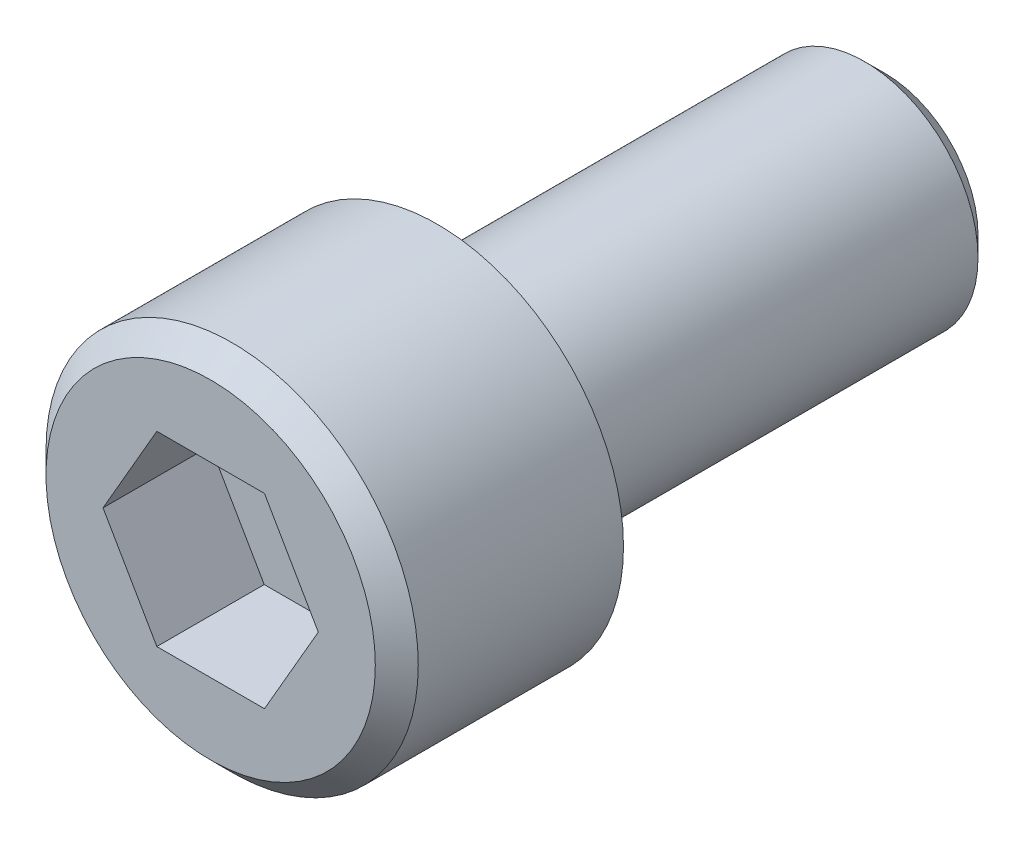
ISO-10303-21;
HEADER;
FILE_DESCRIPTION(('STEP AP214'),'2;1');
FILE_NAME('part.step','',(''),(''),'','','');
FILE_SCHEMA(('AUTOMOTIVE_DESIGN { 1 0 10303 214 1 1 1 1 }'));
ENDSEC;
DATA;
#1=APPLICATION_CONTEXT('core data for automotive mechanical design processes');
#2=APPLICATION_PROTOCOL_DEFINITION('international standard','automotive_design',2000,#1);
#3=PRODUCT_CONTEXT('',#1,'mechanical');
#4=PRODUCT('Part','Part','',(#3));
#5=PRODUCT_RELATED_PRODUCT_CATEGORY('part','',(#4));
#6=PRODUCT_DEFINITION_FORMATION('','',#4);
#7=PRODUCT_DEFINITION_CONTEXT('part definition',#1,'design');
#8=PRODUCT_DEFINITION('design','',#6,#7);
#9=PRODUCT_DEFINITION_SHAPE('','',#8);
#10=(LENGTH_UNIT() NAMED_UNIT(*) SI_UNIT(.MILLI.,.METRE.));
#11=(NAMED_UNIT(*) PLANE_ANGLE_UNIT() SI_UNIT($,.RADIAN.));
#12=(NAMED_UNIT(*) SI_UNIT($,.STERADIAN.) SOLID_ANGLE_UNIT());
#13=UNCERTAINTY_MEASURE_WITH_UNIT(LENGTH_MEASURE(1.E-05),#10,'distance_accuracy_value','');
#14=(GEOMETRIC_REPRESENTATION_CONTEXT(3) GLOBAL_UNCERTAINTY_ASSIGNED_CONTEXT((#13)) GLOBAL_UNIT_ASSIGNED_CONTEXT((#10,
#11,#12)) REPRESENTATION_CONTEXT('',''));
#15=CARTESIAN_POINT('',(0.,0.,0.));
#16=DIRECTION('',(0.,0.,1.));
#17=DIRECTION('',(1.,0.,0.));
#18=AXIS2_PLACEMENT_3D('',#15,#16,#17);
#19=CARTESIAN_POINT('',(0.,0.,4.826));
#20=DIRECTION('',(0.,0.,-1.));
#21=DIRECTION('',(-1.,0.,0.));
#22=AXIS2_PLACEMENT_3D('',#19,#20,#21);
#23=CYLINDRICAL_SURFACE('',#22,3.9624);
#24=CARTESIAN_POINT('',(0.,0.,4.3688));
#25=DIRECTION('',(0.,0.,1.));
#26=DIRECTION('',(1.,0.,0.));
#27=AXIS2_PLACEMENT_3D('',#24,#25,#26);
#28=CIRCLE('',#27,3.9624);
#29=CARTESIAN_POINT('',(3.9624,0.,4.3688));
#30=VERTEX_POINT('',#29);
#31=EDGE_CURVE('E148',#30,#30,#28,.F.);
#32=ORIENTED_EDGE('',*,*,#31,.T.);
#33=EDGE_LOOP('',(#32));
#34=FACE_BOUND('',#33,.T.);
#35=CARTESIAN_POINT('',(0.,0.,0.));
#36=DIRECTION('',(0.,0.,1.));
#37=DIRECTION('',(1.,0.,0.));
#38=AXIS2_PLACEMENT_3D('',#35,#36,#37);
#39=CIRCLE('',#38,3.9624);
#40=CARTESIAN_POINT('',(3.9624,0.,0.));
#41=VERTEX_POINT('',#40);
#42=EDGE_CURVE('E140',#41,#41,#39,.T.);
#43=ORIENTED_EDGE('',*,*,#42,.T.);
#44=EDGE_LOOP('',(#43));
#45=FACE_BOUND('',#44,.T.);
#46=ADVANCED_FACE('F17',(#34,#45),#23,.T.);
#47=CARTESIAN_POINT('',(0.,0.,4.826));
#48=DIRECTION('',(0.,0.,1.));
#49=DIRECTION('',(1.,0.,0.));
#50=AXIS2_PLACEMENT_3D('',#47,#48,#49);
#51=PLANE('',#50);
#52=CARTESIAN_POINT('',(0.,0.,4.826));
#53=DIRECTION('',(0.,0.,1.));
#54=DIRECTION('',(1.,0.,0.));
#55=AXIS2_PLACEMENT_3D('',#52,#53,#54);
#56=CIRCLE('',#55,3.5052);
#57=CARTESIAN_POINT('',(3.5052,0.,4.826));
#58=VERTEX_POINT('',#57);
#59=EDGE_CURVE('E144',#58,#58,#56,.T.);
#60=ORIENTED_EDGE('',*,*,#59,.T.);
#61=EDGE_LOOP('',(#60));
#62=FACE_BOUND('',#61,.T.);
#63=DIRECTION('',(-0.5,0.866025403784439,0.));
#64=VECTOR('',#63,1.);
#65=CARTESIAN_POINT('',(1.71851916063474,0.9921875,4.826));
#66=LINE('',#65,#64);
#67=CARTESIAN_POINT('',(2.29135888084633,0.,4.826));
#68=VERTEX_POINT('',#67);
#69=CARTESIAN_POINT('',(1.14567944042316,1.984375,4.826));
#70=VERTEX_POINT('',#69);
#71=EDGE_CURVE('E111',#68,#70,#66,.T.);
#72=ORIENTED_EDGE('',*,*,#71,.F.);
#73=DIRECTION('',(0.5,0.866025403784439,0.));
#74=VECTOR('',#73,1.);
#75=CARTESIAN_POINT('',(1.71851916063474,-0.9921875,4.826));
#76=LINE('',#75,#74);
#77=CARTESIAN_POINT('',(1.14567944042316,-1.984375,4.826));
#78=VERTEX_POINT('',#77);
#79=EDGE_CURVE('E125',#78,#68,#76,.T.);
#80=ORIENTED_EDGE('',*,*,#79,.F.);
#81=DIRECTION('',(1.,0.,0.));
#82=VECTOR('',#81,1.);
#83=CARTESIAN_POINT('',(0.,-1.984375,4.826));
#84=LINE('',#83,#82);
#85=CARTESIAN_POINT('',(-1.14567944042316,-1.984375,4.826));
#86=VERTEX_POINT('',#85);
#87=EDGE_CURVE('E34',#86,#78,#84,.T.);
#88=ORIENTED_EDGE('',*,*,#87,.F.);
#89=DIRECTION('',(0.5,-0.866025403784439,0.));
#90=VECTOR('',#89,1.);
#91=CARTESIAN_POINT('',(-1.71851916063474,-0.9921875,4.826));
#92=LINE('',#91,#90);
#93=CARTESIAN_POINT('',(-2.29135888084633,0.,4.826));
#94=VERTEX_POINT('',#93);
#95=EDGE_CURVE('E83',#94,#86,#92,.T.);
#96=ORIENTED_EDGE('',*,*,#95,.F.);
#97=DIRECTION('',(-0.5,-0.866025403784439,0.));
#98=VECTOR('',#97,1.);
#99=CARTESIAN_POINT('',(-1.71851916063474,0.9921875,4.826));
#100=LINE('',#99,#98);
#101=CARTESIAN_POINT('',(-1.14567944042316,1.984375,4.826));
#102=VERTEX_POINT('',#101);
#103=EDGE_CURVE('E117',#102,#94,#100,.T.);
#104=ORIENTED_EDGE('',*,*,#103,.F.);
#105=DIRECTION('',(-1.,0.,0.));
#106=VECTOR('',#105,1.);
#107=CARTESIAN_POINT('',(0.,1.984375,4.826));
#108=LINE('',#107,#106);
#109=EDGE_CURVE('E113',#70,#102,#108,.T.);
#110=ORIENTED_EDGE('',*,*,#109,.F.);
#111=EDGE_LOOP('',(#72,#80,#88,#96,#104,#110));
#112=FACE_BOUND('',#111,.T.);
#113=ADVANCED_FACE('F175',(#62,#112),#51,.T.);
#114=CARTESIAN_POINT('',(0.,0.,0.));
#115=DIRECTION('',(0.,0.,1.));
#116=DIRECTION('',(1.,0.,0.));
#117=AXIS2_PLACEMENT_3D('',#114,#115,#116);
#118=PLANE('',#117);
#119=CARTESIAN_POINT('',(0.,0.,0.));
#120=DIRECTION('',(0.,0.,-1.));
#121=DIRECTION('',(-1.,0.,0.));
#122=AXIS2_PLACEMENT_3D('',#119,#120,#121);
#123=CIRCLE('',#122,2.413);
#124=CARTESIAN_POINT('',(-2.413,0.,0.));
#125=VERTEX_POINT('',#124);
#126=EDGE_CURVE('E151',#125,#125,#123,.T.);
#127=ORIENTED_EDGE('',*,*,#126,.F.);
#128=EDGE_LOOP('',(#127));
#129=FACE_BOUND('',#128,.T.);
#130=ORIENTED_EDGE('',*,*,#42,.F.);
#131=EDGE_LOOP('',(#130));
#132=FACE_BOUND('',#131,.T.);
#133=ADVANCED_FACE('F181',(#129,#132),#118,.F.);
#134=CARTESIAN_POINT('',(1.71851916063474,0.9921875,2.54));
#135=DIRECTION('',(0.866025403784439,0.5,0.));
#136=DIRECTION('',(-0.5,0.866025403784439,0.));
#137=AXIS2_PLACEMENT_3D('',#134,#135,#136);
#138=PLANE('',#137);
#139=ORIENTED_EDGE('',*,*,#71,.T.);
#140=DIRECTION('',(0.,0.,1.));
#141=VECTOR('',#140,1.);
#142=CARTESIAN_POINT('',(1.14567944042316,1.984375,2.54));
#143=LINE('',#142,#141);
#144=CARTESIAN_POINT('',(1.14567944042316,1.984375,2.54));
#145=VERTEX_POINT('',#144);
#146=EDGE_CURVE('E67',#145,#70,#143,.T.);
#147=ORIENTED_EDGE('',*,*,#146,.F.);
#148=DIRECTION('',(-0.5,0.866025403784439,0.));
#149=VECTOR('',#148,1.);
#150=CARTESIAN_POINT('',(1.71851916063474,0.9921875,2.54));
#151=LINE('',#150,#149);
#152=CARTESIAN_POINT('',(2.29135888084633,0.,2.54));
#153=VERTEX_POINT('',#152);
#154=EDGE_CURVE('E128',#153,#145,#151,.T.);
#155=ORIENTED_EDGE('',*,*,#154,.F.);
#156=DIRECTION('',(0.,0.,1.));
#157=VECTOR('',#156,1.);
#158=CARTESIAN_POINT('',(2.29135888084633,0.,2.54));
#159=LINE('',#158,#157);
#160=EDGE_CURVE('E43',#153,#68,#159,.T.);
#161=ORIENTED_EDGE('',*,*,#160,.T.);
#162=EDGE_LOOP('',(#139,#147,#155,#161));
#163=FACE_BOUND('',#162,.T.);
#164=ADVANCED_FACE('F178',(#163),#138,.F.);
#165=CARTESIAN_POINT('',(0.,1.984375,2.54));
#166=DIRECTION('',(0.,1.,0.));
#167=DIRECTION('',(0.,0.,1.));
#168=AXIS2_PLACEMENT_3D('',#165,#166,#167);
#169=PLANE('',#168);
#170=ORIENTED_EDGE('',*,*,#109,.T.);
#171=DIRECTION('',(0.,0.,1.));
#172=VECTOR('',#171,1.);
#173=CARTESIAN_POINT('',(-1.14567944042316,1.984375,2.54));
#174=LINE('',#173,#172);
#175=CARTESIAN_POINT('',(-1.14567944042316,1.984375,2.54));
#176=VERTEX_POINT('',#175);
#177=EDGE_CURVE('E135',#176,#102,#174,.T.);
#178=ORIENTED_EDGE('',*,*,#177,.F.);
#179=DIRECTION('',(-1.,0.,0.));
#180=VECTOR('',#179,1.);
#181=CARTESIAN_POINT('',(0.,1.984375,2.54));
#182=LINE('',#181,#180);
#183=EDGE_CURVE('E164',#145,#176,#182,.T.);
#184=ORIENTED_EDGE('',*,*,#183,.F.);
#185=ORIENTED_EDGE('',*,*,#146,.T.);
#186=EDGE_LOOP('',(#170,#178,#184,#185));
#187=FACE_BOUND('',#186,.T.);
#188=ADVANCED_FACE('F180',(#187),#169,.F.);
#189=CARTESIAN_POINT('',(-1.71851916063474,0.9921875,2.54));
#190=DIRECTION('',(-0.866025403784439,0.5,0.));
#191=DIRECTION('',(-0.5,-0.866025403784439,0.));
#192=AXIS2_PLACEMENT_3D('',#189,#190,#191);
#193=PLANE('',#192);
#194=ORIENTED_EDGE('',*,*,#103,.T.);
#195=DIRECTION('',(0.,0.,1.));
#196=VECTOR('',#195,1.);
#197=CARTESIAN_POINT('',(-2.29135888084633,0.,2.54));
#198=LINE('',#197,#196);
#199=CARTESIAN_POINT('',(-2.29135888084633,0.,2.54));
#200=VERTEX_POINT('',#199);
#201=EDGE_CURVE('E86',#200,#94,#198,.T.);
#202=ORIENTED_EDGE('',*,*,#201,.F.);
#203=DIRECTION('',(-0.5,-0.866025403784439,0.));
#204=VECTOR('',#203,1.);
#205=CARTESIAN_POINT('',(-1.71851916063474,0.9921875,2.54));
#206=LINE('',#205,#204);
#207=EDGE_CURVE('E97',#176,#200,#206,.T.);
#208=ORIENTED_EDGE('',*,*,#207,.F.);
#209=ORIENTED_EDGE('',*,*,#177,.T.);
#210=EDGE_LOOP('',(#194,#202,#208,#209));
#211=FACE_BOUND('',#210,.T.);
#212=ADVANCED_FACE('F170',(#211),#193,.F.);
#213=CARTESIAN_POINT('',(-1.71851916063474,-0.9921875,2.54));
#214=DIRECTION('',(-0.866025403784439,-0.5,0.));
#215=DIRECTION('',(0.5,-0.866025403784439,0.));
#216=AXIS2_PLACEMENT_3D('',#213,#214,#215);
#217=PLANE('',#216);
#218=ORIENTED_EDGE('',*,*,#95,.T.);
#219=DIRECTION('',(0.,0.,1.));
#220=VECTOR('',#219,1.);
#221=CARTESIAN_POINT('',(-1.14567944042316,-1.984375,2.54));
#222=LINE('',#221,#220);
#223=CARTESIAN_POINT('',(-1.14567944042316,-1.984375,2.54));
#224=VERTEX_POINT('',#223);
#225=EDGE_CURVE('E78',#224,#86,#222,.T.);
#226=ORIENTED_EDGE('',*,*,#225,.F.);
#227=DIRECTION('',(0.5,-0.866025403784439,0.));
#228=VECTOR('',#227,1.);
#229=CARTESIAN_POINT('',(-1.71851916063474,-0.9921875,2.54));
#230=LINE('',#229,#228);
#231=EDGE_CURVE('E81',#200,#224,#230,.T.);
#232=ORIENTED_EDGE('',*,*,#231,.F.);
#233=ORIENTED_EDGE('',*,*,#201,.T.);
#234=EDGE_LOOP('',(#218,#226,#232,#233));
#235=FACE_BOUND('',#234,.T.);
#236=ADVANCED_FACE('F80',(#235),#217,.F.);
#237=CARTESIAN_POINT('',(0.,-1.984375,2.54));
#238=DIRECTION('',(0.,-1.,0.));
#239=DIRECTION('',(0.,0.,-1.));
#240=AXIS2_PLACEMENT_3D('',#237,#238,#239);
#241=PLANE('',#240);
#242=ORIENTED_EDGE('',*,*,#87,.T.);
#243=DIRECTION('',(0.,0.,1.));
#244=VECTOR('',#243,1.);
#245=CARTESIAN_POINT('',(1.14567944042316,-1.984375,2.54));
#246=LINE('',#245,#244);
#247=CARTESIAN_POINT('',(1.14567944042316,-1.984375,2.54));
#248=VERTEX_POINT('',#247);
#249=EDGE_CURVE('E87',#248,#78,#246,.T.);
#250=ORIENTED_EDGE('',*,*,#249,.F.);
#251=DIRECTION('',(1.,0.,0.));
#252=VECTOR('',#251,1.);
#253=CARTESIAN_POINT('',(0.,-1.984375,2.54));
#254=LINE('',#253,#252);
#255=EDGE_CURVE('E94',#224,#248,#254,.T.);
#256=ORIENTED_EDGE('',*,*,#255,.F.);
#257=ORIENTED_EDGE('',*,*,#225,.T.);
#258=EDGE_LOOP('',(#242,#250,#256,#257));
#259=FACE_BOUND('',#258,.T.);
#260=ADVANCED_FACE('F100',(#259),#241,.F.);
#261=CARTESIAN_POINT('',(1.71851916063474,-0.9921875,2.54));
#262=DIRECTION('',(0.866025403784438,-0.5,0.));
#263=DIRECTION('',(0.5,0.866025403784439,0.));
#264=AXIS2_PLACEMENT_3D('',#261,#262,#263);
#265=PLANE('',#264);
#266=ORIENTED_EDGE('',*,*,#79,.T.);
#267=ORIENTED_EDGE('',*,*,#160,.F.);
#268=DIRECTION('',(0.5,0.866025403784439,0.));
#269=VECTOR('',#268,1.);
#270=CARTESIAN_POINT('',(1.71851916063474,-0.9921875,2.54));
#271=LINE('',#270,#269);
#272=EDGE_CURVE('E102',#248,#153,#271,.T.);
#273=ORIENTED_EDGE('',*,*,#272,.F.);
#274=ORIENTED_EDGE('',*,*,#249,.T.);
#275=EDGE_LOOP('',(#266,#267,#273,#274));
#276=FACE_BOUND('',#275,.T.);
#277=ADVANCED_FACE('F177',(#276),#265,.F.);
#278=CARTESIAN_POINT('',(0.,0.,2.54));
#279=DIRECTION('',(0.,0.,1.));
#280=DIRECTION('',(1.,0.,0.));
#281=AXIS2_PLACEMENT_3D('',#278,#279,#280);
#282=PLANE('',#281);
#283=ORIENTED_EDGE('',*,*,#154,.T.);
#284=ORIENTED_EDGE('',*,*,#183,.T.);
#285=ORIENTED_EDGE('',*,*,#207,.T.);
#286=ORIENTED_EDGE('',*,*,#231,.T.);
#287=ORIENTED_EDGE('',*,*,#255,.T.);
#288=ORIENTED_EDGE('',*,*,#272,.T.);
#289=EDGE_LOOP('',(#283,#284,#285,#286,#287,#288));
#290=FACE_BOUND('',#289,.T.);
#291=ADVANCED_FACE('F93',(#290),#282,.T.);
#292=CARTESIAN_POINT('',(0.,0.,4.826));
#293=DIRECTION('',(0.,0.,-1.));
#294=DIRECTION('',(-1.,0.,0.));
#295=AXIS2_PLACEMENT_3D('',#292,#293,#294);
#296=CONICAL_SURFACE('',#295,3.5052,0.785398163397449);
#297=ORIENTED_EDGE('',*,*,#31,.F.);
#298=EDGE_LOOP('',(#297));
#299=FACE_BOUND('',#298,.T.);
#300=ORIENTED_EDGE('',*,*,#59,.F.);
#301=EDGE_LOOP('',(#300));
#302=FACE_BOUND('',#301,.T.);
#303=ADVANCED_FACE('F199',(#299,#302),#296,.T.);
#304=CARTESIAN_POINT('',(0.,0.,-9.525));
#305=DIRECTION('',(0.,0.,1.));
#306=DIRECTION('',(1.,0.,0.));
#307=AXIS2_PLACEMENT_3D('',#304,#305,#306);
#308=CYLINDRICAL_SURFACE('',#307,2.413);
#309=CARTESIAN_POINT('',(0.,0.,-9.0960702));
#310=DIRECTION('',(0.,0.,-1.));
#311=DIRECTION('',(-1.,0.,0.));
#312=AXIS2_PLACEMENT_3D('',#309,#310,#311);
#313=CIRCLE('',#312,2.413);
#314=CARTESIAN_POINT('',(-2.413,0.,-9.0960702));
#315=VERTEX_POINT('',#314);
#316=EDGE_CURVE('E11',#315,#315,#313,.F.);
#317=ORIENTED_EDGE('',*,*,#316,.T.);
#318=EDGE_LOOP('',(#317));
#319=FACE_BOUND('',#318,.T.);
#320=ORIENTED_EDGE('',*,*,#126,.T.);
#321=EDGE_LOOP('',(#320));
#322=FACE_BOUND('',#321,.T.);
#323=ADVANCED_FACE('F204',(#319,#322),#308,.T.);
#324=CARTESIAN_POINT('',(0.,0.,-9.525));
#325=DIRECTION('',(0.,0.,-1.));
#326=DIRECTION('',(1.,0.,0.));
#327=AXIS2_PLACEMENT_3D('',#324,#325,#326);
#328=PLANE('',#327);
#329=CARTESIAN_POINT('',(0.,0.,-9.525));
#330=DIRECTION('',(0.,0.,-1.));
#331=DIRECTION('',(-1.,0.,0.));
#332=AXIS2_PLACEMENT_3D('',#329,#330,#331);
#333=CIRCLE('',#332,1.9840702);
#334=CARTESIAN_POINT('',(-1.9840702,0.,-9.525));
#335=VERTEX_POINT('',#334);
#336=EDGE_CURVE('E27',#335,#335,#333,.T.);
#337=ORIENTED_EDGE('',*,*,#336,.T.);
#338=EDGE_LOOP('',(#337));
#339=FACE_BOUND('',#338,.T.);
#340=ADVANCED_FACE('F209',(#339),#328,.T.);
#341=CARTESIAN_POINT('',(0.,0.,-9.525));
#342=DIRECTION('',(0.,0.,1.));
#343=DIRECTION('',(1.,0.,0.));
#344=AXIS2_PLACEMENT_3D('',#341,#342,#343);
#345=CONICAL_SURFACE('',#344,1.9840702,0.785398163397448);
#346=ORIENTED_EDGE('',*,*,#316,.F.);
#347=EDGE_LOOP('',(#346));
#348=FACE_BOUND('',#347,.T.);
#349=ORIENTED_EDGE('',*,*,#336,.F.);
#350=EDGE_LOOP('',(#349));
#351=FACE_BOUND('',#350,.T.);
#352=ADVANCED_FACE('F20',(#348,#351),#345,.T.);
#353=CLOSED_SHELL('',(#46,#113,#133,#164,#188,#212,#236,#260,#277,#291,#303,#323,#340,#352));
#354=MANIFOLD_SOLID_BREP('B1',#353);
#355=ADVANCED_BREP_SHAPE_REPRESENTATION('',(#18,#354),#14);
#356=SHAPE_DEFINITION_REPRESENTATION(#9,#355);
ENDSEC;
END-ISO-10303-21;
